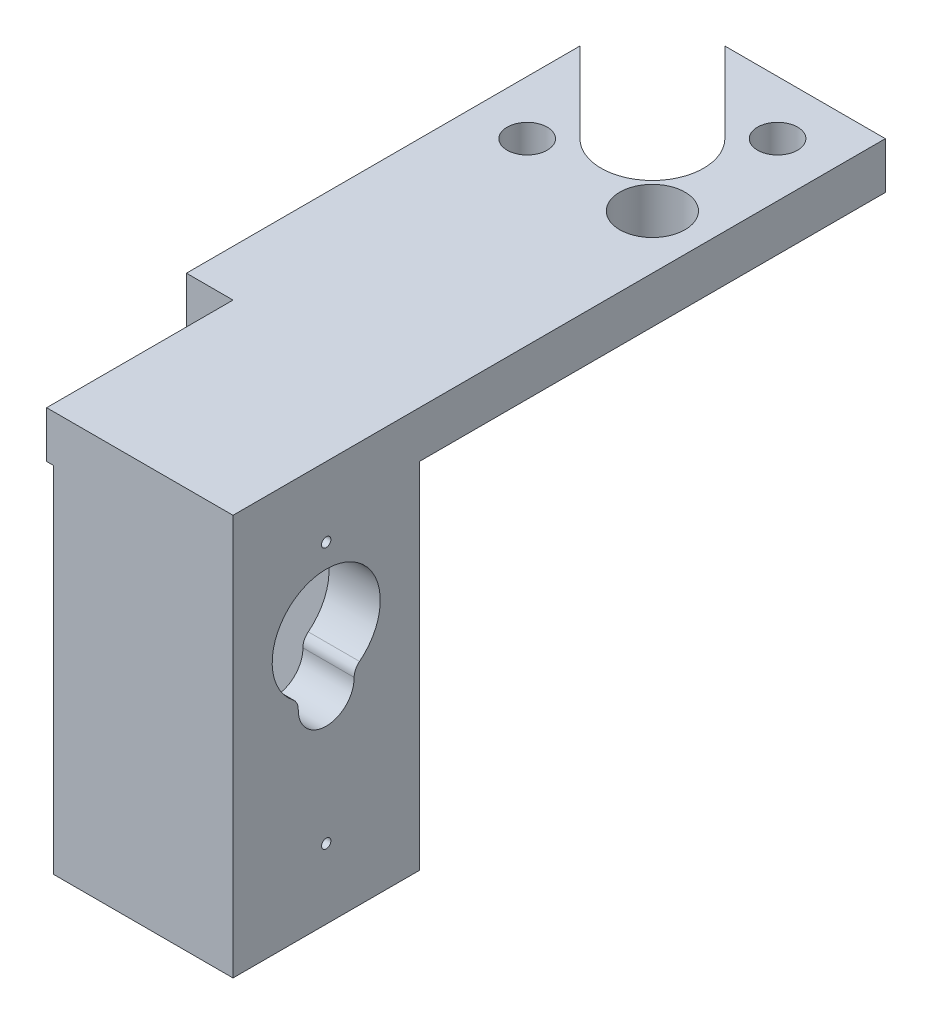
ISO-10303-21;
HEADER;
FILE_DESCRIPTION(('STEP AP214'),'2;1');
FILE_NAME('part.step','',(''),(''),'','','');
FILE_SCHEMA(('AUTOMOTIVE_DESIGN { 1 0 10303 214 1 1 1 1 }'));
ENDSEC;
DATA;
#1=APPLICATION_CONTEXT('core data for automotive mechanical design processes');
#2=APPLICATION_PROTOCOL_DEFINITION('international standard','automotive_design',2000,#1);
#3=PRODUCT_CONTEXT('',#1,'mechanical');
#4=PRODUCT('Part','Part','',(#3));
#5=PRODUCT_RELATED_PRODUCT_CATEGORY('part','',(#4));
#6=PRODUCT_DEFINITION_FORMATION('','',#4);
#7=PRODUCT_DEFINITION_CONTEXT('part definition',#1,'design');
#8=PRODUCT_DEFINITION('design','',#6,#7);
#9=PRODUCT_DEFINITION_SHAPE('','',#8);
#10=(LENGTH_UNIT() NAMED_UNIT(*) SI_UNIT(.MILLI.,.METRE.));
#11=(NAMED_UNIT(*) PLANE_ANGLE_UNIT() SI_UNIT($,.RADIAN.));
#12=(NAMED_UNIT(*) SI_UNIT($,.STERADIAN.) SOLID_ANGLE_UNIT());
#13=UNCERTAINTY_MEASURE_WITH_UNIT(LENGTH_MEASURE(1.E-05),#10,'distance_accuracy_value','');
#14=(GEOMETRIC_REPRESENTATION_CONTEXT(3) GLOBAL_UNCERTAINTY_ASSIGNED_CONTEXT((#13)) GLOBAL_UNIT_ASSIGNED_CONTEXT((#10,
#11,#12)) REPRESENTATION_CONTEXT('',''));
#15=CARTESIAN_POINT('',(0.,0.,0.));
#16=DIRECTION('',(0.,0.,1.));
#17=DIRECTION('',(1.,0.,0.));
#18=AXIS2_PLACEMENT_3D('',#15,#16,#17);
#19=CARTESIAN_POINT('',(0.,374.684836728763,0.));
#20=DIRECTION('',(0.,1.,0.));
#21=DIRECTION('',(0.,0.,1.));
#22=AXIS2_PLACEMENT_3D('',#19,#20,#21);
#23=PLANE('',#22);
#24=DIRECTION('',(0.,0.,-1.));
#25=VECTOR('',#24,1.);
#26=CARTESIAN_POINT('',(-20.2411337173931,374.684836728763,0.));
#27=LINE('',#26,#25);
#28=CARTESIAN_POINT('',(-20.2411337173931,374.684836728763,322.549454326368));
#29=VERTEX_POINT('',#28);
#30=CARTESIAN_POINT('',(-20.2411337173931,374.684836728763,302.549454326368));
#31=VERTEX_POINT('',#30);
#32=EDGE_CURVE('E291',#29,#31,#27,.T.);
#33=ORIENTED_EDGE('',*,*,#32,.T.);
#34=DIRECTION('',(-1.,0.,0.));
#35=VECTOR('',#34,1.);
#36=CARTESIAN_POINT('',(0.,374.684836728763,302.549454326368));
#37=LINE('',#36,#35);
#38=CARTESIAN_POINT('',(-25.2411337173932,374.684836728763,302.549454326368));
#39=VERTEX_POINT('',#38);
#40=EDGE_CURVE('E299',#31,#39,#37,.T.);
#41=ORIENTED_EDGE('',*,*,#40,.T.);
#42=DIRECTION('',(0.,0.,1.));
#43=VECTOR('',#42,1.);
#44=CARTESIAN_POINT('',(-25.2411337173931,374.684836728763,0.));
#45=LINE('',#44,#43);
#46=CARTESIAN_POINT('',(-25.2411337173932,374.684836728763,260.32762891942));
#47=VERTEX_POINT('',#46);
#48=EDGE_CURVE('E320',#47,#39,#45,.T.);
#49=ORIENTED_EDGE('',*,*,#48,.F.);
#50=DIRECTION('',(0.707106781186547,0.,0.707106781186548));
#51=VECTOR('',#50,1.);
#52=CARTESIAN_POINT('',(-142.784381318406,374.684836728763,142.784381318406));
#53=LINE('',#52,#51);
#54=CARTESIAN_POINT('',(-16.6302210139191,374.684836728763,268.938541622893));
#55=VERTEX_POINT('',#54);
#56=EDGE_CURVE('E329',#47,#55,#53,.T.);
#57=ORIENTED_EDGE('',*,*,#56,.T.);
#58=CARTESIAN_POINT('',(-12.7411337173932,374.684836728763,265.049454326367));
#59=DIRECTION('',(0.,1.,0.));
#60=DIRECTION('',(0.,0.,1.));
#61=AXIS2_PLACEMENT_3D('',#58,#59,#60);
#62=CIRCLE('',#61,5.5);
#63=CARTESIAN_POINT('',(-8.8520464208672,374.684836728763,261.160367029841));
#64=VERTEX_POINT('',#63);
#65=EDGE_CURVE('E421',#55,#64,#62,.T.);
#66=ORIENTED_EDGE('',*,*,#65,.T.);
#67=DIRECTION('',(-0.707106781186549,0.,-0.707106781186546));
#68=VECTOR('',#67,1.);
#69=CARTESIAN_POINT('',(-135.006206725354,374.684836728763,135.006206725355));
#70=LINE('',#69,#68);
#71=CARTESIAN_POINT('',(-17.4629591243411,374.684836728763,252.549454326368));
#72=VERTEX_POINT('',#71);
#73=EDGE_CURVE('E336',#64,#72,#70,.T.);
#74=ORIENTED_EDGE('',*,*,#73,.T.);
#75=DIRECTION('',(-1.,0.,0.));
#76=VECTOR('',#75,1.);
#77=CARTESIAN_POINT('',(-5.60772438099305E-13,374.684836728763,252.549454326368));
#78=LINE('',#77,#76);
#79=CARTESIAN_POINT('',(-0.241133717393146,374.684836728763,252.549454326368));
#80=VERTEX_POINT('',#79);
#81=EDGE_CURVE('E325',#80,#72,#78,.T.);
#82=ORIENTED_EDGE('',*,*,#81,.F.);
#83=DIRECTION('',(0.,0.,1.));
#84=VECTOR('',#83,1.);
#85=CARTESIAN_POINT('',(-0.241133717393153,374.684836728763,0.));
#86=LINE('',#85,#84);
#87=CARTESIAN_POINT('',(-0.241133717393145,374.684836728763,302.549454326368));
#88=VERTEX_POINT('',#87);
#89=EDGE_CURVE('E319',#80,#88,#86,.T.);
#90=ORIENTED_EDGE('',*,*,#89,.T.);
#91=DIRECTION('',(1.,0.,0.));
#92=VECTOR('',#91,1.);
#93=CARTESIAN_POINT('',(-5.74113371739314,374.684836728763,302.549454326368));
#94=LINE('',#93,#92);
#95=CARTESIAN_POINT('',(-19.4911337173931,374.684836728763,302.549454326368));
#96=VERTEX_POINT('',#95);
#97=EDGE_CURVE('E422',#96,#88,#94,.T.);
#98=ORIENTED_EDGE('',*,*,#97,.F.);
#99=DIRECTION('',(0.,0.,-1.));
#100=VECTOR('',#99,1.);
#101=CARTESIAN_POINT('',(-19.4911337173932,374.684836728763,0.));
#102=LINE('',#101,#100);
#103=CARTESIAN_POINT('',(-19.4911337173931,374.684836728763,306.549454326368));
#104=VERTEX_POINT('',#103);
#105=EDGE_CURVE('E519',#104,#96,#102,.T.);
#106=ORIENTED_EDGE('',*,*,#105,.F.);
#107=DIRECTION('',(1.,0.,0.));
#108=VECTOR('',#107,1.);
#109=CARTESIAN_POINT('',(-19.4911337173931,374.684836728763,306.549454326368));
#110=LINE('',#109,#108);
#111=CARTESIAN_POINT('',(-7.49113371739314,374.684836728763,306.549454326368));
#112=VERTEX_POINT('',#111);
#113=EDGE_CURVE('E531',#104,#112,#110,.T.);
#114=ORIENTED_EDGE('',*,*,#113,.T.);
#115=DIRECTION('',(0.,0.,-1.));
#116=VECTOR('',#115,1.);
#117=CARTESIAN_POINT('',(-7.49113371739315,374.684836728763,0.));
#118=LINE('',#117,#116);
#119=CARTESIAN_POINT('',(-7.49113371739314,374.684836728763,318.549454326368));
#120=VERTEX_POINT('',#119);
#121=EDGE_CURVE('E575',#120,#112,#118,.T.);
#122=ORIENTED_EDGE('',*,*,#121,.F.);
#123=DIRECTION('',(1.,0.,0.));
#124=VECTOR('',#123,1.);
#125=CARTESIAN_POINT('',(-19.4911337173931,374.684836728763,318.549454326368));
#126=LINE('',#125,#124);
#127=CARTESIAN_POINT('',(-19.4911337173931,374.684836728763,318.549454326368));
#128=VERTEX_POINT('',#127);
#129=EDGE_CURVE('E499',#128,#120,#126,.T.);
#130=ORIENTED_EDGE('',*,*,#129,.F.);
#131=DIRECTION('',(0.,0.,-1.));
#132=VECTOR('',#131,1.);
#133=CARTESIAN_POINT('',(-19.4911337173932,374.684836728763,0.));
#134=LINE('',#133,#132);
#135=CARTESIAN_POINT('',(-19.4911337173931,374.684836728763,322.549454326368));
#136=VERTEX_POINT('',#135);
#137=EDGE_CURVE('E317',#136,#128,#134,.T.);
#138=ORIENTED_EDGE('',*,*,#137,.F.);
#139=DIRECTION('',(-1.,0.,0.));
#140=VECTOR('',#139,1.);
#141=CARTESIAN_POINT('',(-7.16203661546827E-13,374.684836728763,322.549454326368));
#142=LINE('',#141,#140);
#143=EDGE_CURVE('E307',#136,#29,#142,.T.);
#144=ORIENTED_EDGE('',*,*,#143,.T.);
#145=EDGE_LOOP('',(#33,#41,#49,#57,#66,#74,#82,#90,#98,#106,#114,#122,#130,#138,#144));
#146=FACE_BOUND('',#145,.T.);
#147=CARTESIAN_POINT('',(-6.02361843508116,374.684836728763,258.331940766135));
#148=DIRECTION('',(0.,1.,0.));
#149=DIRECTION('',(0.,0.,1.));
#150=AXIS2_PLACEMENT_3D('',#147,#148,#149);
#151=CIRCLE('',#150,2.15);
#152=CARTESIAN_POINT('',(-6.02361843508116,374.684836728763,260.481940766135));
#153=VERTEX_POINT('',#152);
#154=EDGE_CURVE('E344',#153,#153,#151,.T.);
#155=ORIENTED_EDGE('',*,*,#154,.T.);
#156=EDGE_LOOP('',(#155));
#157=FACE_BOUND('',#156,.T.);
#158=CARTESIAN_POINT('',(-19.4586489997051,374.684836728763,271.7669678866));
#159=DIRECTION('',(0.,1.,0.));
#160=DIRECTION('',(0.,0.,1.));
#161=AXIS2_PLACEMENT_3D('',#158,#159,#160);
#162=CIRCLE('',#161,2.15);
#163=CARTESIAN_POINT('',(-19.4586489997051,374.684836728763,273.9169678866));
#164=VERTEX_POINT('',#163);
#165=EDGE_CURVE('E340',#164,#164,#162,.T.);
#166=ORIENTED_EDGE('',*,*,#165,.T.);
#167=EDGE_LOOP('',(#166));
#168=FACE_BOUND('',#167,.T.);
#169=CARTESIAN_POINT('',(-6.02361893947252,374.684836728763,271.766970826347));
#170=DIRECTION('',(0.,1.,0.));
#171=DIRECTION('',(0.,0.,1.));
#172=AXIS2_PLACEMENT_3D('',#169,#170,#171);
#173=CIRCLE('',#172,3.5);
#174=CARTESIAN_POINT('',(-6.02361893947252,374.684836728763,275.266970826347));
#175=VERTEX_POINT('',#174);
#176=EDGE_CURVE('E417',#175,#175,#173,.T.);
#177=ORIENTED_EDGE('',*,*,#176,.T.);
#178=EDGE_LOOP('',(#177));
#179=FACE_BOUND('',#178,.T.);
#180=ADVANCED_FACE('F79',(#146,#157,#168,#179),#23,.F.);
#181=CARTESIAN_POINT('',(-7.4911337173931,0.,0.));
#182=DIRECTION('',(1.,0.,0.));
#183=DIRECTION('',(0.,1.,0.));
#184=AXIS2_PLACEMENT_3D('',#181,#182,#183);
#185=PLANE('',#184);
#186=CARTESIAN_POINT('',(-7.49113371739314,372.184836728763,312.549454326368));
#187=DIRECTION('',(1.,0.,0.));
#188=DIRECTION('',(0.,1.,0.));
#189=AXIS2_PLACEMENT_3D('',#186,#187,#188);
#190=CIRCLE('',#189,0.500000000000026);
#191=CARTESIAN_POINT('',(-7.49113371739314,372.684836728763,312.549454326368));
#192=VERTEX_POINT('',#191);
#193=EDGE_CURVE('E311',#192,#192,#190,.T.);
#194=ORIENTED_EDGE('',*,*,#193,.T.);
#195=EDGE_LOOP('',(#194));
#196=FACE_BOUND('',#195,.T.);
#197=DIRECTION('',(0.,-1.,0.));
#198=VECTOR('',#197,1.);
#199=CARTESIAN_POINT('',(-7.49113371739309,0.,318.549454326368));
#200=LINE('',#199,#198);
#201=CARTESIAN_POINT('',(-7.49113371739314,369.684836728764,318.549454326368));
#202=VERTEX_POINT('',#201);
#203=EDGE_CURVE('E532',#120,#202,#200,.T.);
#204=ORIENTED_EDGE('',*,*,#203,.F.);
#205=ORIENTED_EDGE('',*,*,#121,.T.);
#206=DIRECTION('',(0.,-1.,0.));
#207=VECTOR('',#206,1.);
#208=CARTESIAN_POINT('',(-7.49113371739309,0.,306.549454326368));
#209=LINE('',#208,#207);
#210=CARTESIAN_POINT('',(-7.49113371739314,369.684836728764,306.549454326368));
#211=VERTEX_POINT('',#210);
#212=EDGE_CURVE('E497',#112,#211,#209,.T.);
#213=ORIENTED_EDGE('',*,*,#212,.T.);
#214=DIRECTION('',(0.,0.,-1.));
#215=VECTOR('',#214,1.);
#216=CARTESIAN_POINT('',(-7.49113371739315,369.684836728764,0.));
#217=LINE('',#216,#215);
#218=EDGE_CURVE('E554',#202,#211,#217,.T.);
#219=ORIENTED_EDGE('',*,*,#218,.F.);
#220=EDGE_LOOP('',(#204,#205,#213,#219));
#221=FACE_BOUND('',#220,.T.);
#222=ADVANCED_FACE('F641',(#196,#221),#185,.F.);
#223=CARTESIAN_POINT('',(-7.49113371739314,344.184836728764,312.549454326368));
#224=DIRECTION('',(1.,0.,0.));
#225=DIRECTION('',(0.,1.,0.));
#226=AXIS2_PLACEMENT_3D('',#223,#224,#225);
#227=CIRCLE('',#226,0.500000000000026);
#228=CARTESIAN_POINT('',(-7.49113371739314,344.684836728764,312.549454326368));
#229=VERTEX_POINT('',#228);
#230=EDGE_CURVE('E622',#229,#229,#227,.T.);
#231=ORIENTED_EDGE('',*,*,#230,.T.);
#232=EDGE_LOOP('',(#231));
#233=FACE_BOUND('',#232,.T.);
#234=CARTESIAN_POINT('',(-7.49113371739314,346.684836728764,318.549454326368));
#235=VERTEX_POINT('',#234);
#236=CARTESIAN_POINT('',(-7.49113371739314,341.684836728764,318.549454326368));
#237=VERTEX_POINT('',#236);
#238=EDGE_CURVE('E508',#235,#237,#200,.T.);
#239=ORIENTED_EDGE('',*,*,#238,.F.);
#240=DIRECTION('',(0.,0.,-1.));
#241=VECTOR('',#240,1.);
#242=CARTESIAN_POINT('',(-7.49113371739315,346.684836728764,0.));
#243=LINE('',#242,#241);
#244=CARTESIAN_POINT('',(-7.49113371739314,346.684836728764,306.549454326368));
#245=VERTEX_POINT('',#244);
#246=EDGE_CURVE('E550',#235,#245,#243,.T.);
#247=ORIENTED_EDGE('',*,*,#246,.T.);
#248=CARTESIAN_POINT('',(-7.49113371739314,341.684836728764,306.549454326368));
#249=VERTEX_POINT('',#248);
#250=EDGE_CURVE('E539',#245,#249,#209,.T.);
#251=ORIENTED_EDGE('',*,*,#250,.T.);
#252=DIRECTION('',(0.,0.,-1.));
#253=VECTOR('',#252,1.);
#254=CARTESIAN_POINT('',(-7.49113371739315,341.684836728764,0.));
#255=LINE('',#254,#253);
#256=EDGE_CURVE('E535',#237,#249,#255,.T.);
#257=ORIENTED_EDGE('',*,*,#256,.F.);
#258=EDGE_LOOP('',(#239,#247,#251,#257));
#259=FACE_BOUND('',#258,.T.);
#260=ADVANCED_FACE('F644',(#233,#259),#185,.F.);
#261=CARTESIAN_POINT('',(-5.7411337173931,0.,0.));
#262=DIRECTION('',(1.,0.,0.));
#263=DIRECTION('',(0.,1.,0.));
#264=AXIS2_PLACEMENT_3D('',#261,#262,#263);
#265=PLANE('',#264);
#266=DIRECTION('',(0.,0.,-1.));
#267=VECTOR('',#266,1.);
#268=CARTESIAN_POINT('',(-5.74113371739315,346.684836728764,0.));
#269=LINE('',#268,#267);
#270=CARTESIAN_POINT('',(-5.74113371739314,346.684836728764,318.549454326368));
#271=VERTEX_POINT('',#270);
#272=CARTESIAN_POINT('',(-5.74113371739314,346.684836728764,306.549454326368));
#273=VERTEX_POINT('',#272);
#274=EDGE_CURVE('E500',#271,#273,#269,.T.);
#275=ORIENTED_EDGE('',*,*,#274,.F.);
#276=DIRECTION('',(0.,-1.,0.));
#277=VECTOR('',#276,1.);
#278=CARTESIAN_POINT('',(-5.74113371739309,0.,318.549454326368));
#279=LINE('',#278,#277);
#280=CARTESIAN_POINT('',(-5.74113371739314,369.684836728764,318.549454326368));
#281=VERTEX_POINT('',#280);
#282=EDGE_CURVE('E555',#281,#271,#279,.T.);
#283=ORIENTED_EDGE('',*,*,#282,.F.);
#284=DIRECTION('',(0.,0.,-1.));
#285=VECTOR('',#284,1.);
#286=CARTESIAN_POINT('',(-5.74113371739315,369.684836728764,0.));
#287=LINE('',#286,#285);
#288=CARTESIAN_POINT('',(-5.74113371739314,369.684836728764,312.549454326368));
#289=VERTEX_POINT('',#288);
#290=EDGE_CURVE('E565',#281,#289,#287,.T.);
#291=ORIENTED_EDGE('',*,*,#290,.T.);
#292=CARTESIAN_POINT('',(-5.74113371739314,363.884836728764,312.549454326368));
#293=DIRECTION('',(1.,0.,0.));
#294=DIRECTION('',(0.,1.,0.));
#295=AXIS2_PLACEMENT_3D('',#292,#293,#294);
#296=CIRCLE('',#295,5.80000000000001);
#297=CARTESIAN_POINT('',(-5.74113371739314,359.317713441092,316.124560601041));
#298=VERTEX_POINT('',#297);
#299=EDGE_CURVE('E591',#289,#298,#296,.T.);
#300=ORIENTED_EDGE('',*,*,#299,.T.);
#301=CARTESIAN_POINT('',(-5.74113371739314,358.136560866695,317.049157051388));
#302=DIRECTION('',(1.,0.,0.));
#303=DIRECTION('',(0.,1.,0.));
#304=AXIS2_PLACEMENT_3D('',#301,#302,#303);
#305=CIRCLE('',#304,1.50000000000003);
#306=CARTESIAN_POINT('',(-5.74113371739314,358.119319487384,315.549256143048));
#307=VERTEX_POINT('',#306);
#308=EDGE_CURVE('E457',#307,#298,#305,.T.);
#309=ORIENTED_EDGE('',*,*,#308,.F.);
#310=CARTESIAN_POINT('',(-5.74113371739314,358.084836728764,312.549454326368));
#311=DIRECTION('',(1.,0.,0.));
#312=DIRECTION('',(0.,1.,0.));
#313=AXIS2_PLACEMENT_3D('',#310,#311,#312);
#314=CIRCLE('',#313,2.99999999999999);
#315=CARTESIAN_POINT('',(-5.74113371739314,358.119319487384,309.549652509687));
#316=VERTEX_POINT('',#315);
#317=EDGE_CURVE('E490',#307,#316,#314,.T.);
#318=ORIENTED_EDGE('',*,*,#317,.T.);
#319=CARTESIAN_POINT('',(-5.74113371739314,358.136560866695,308.049751601347));
#320=DIRECTION('',(1.,0.,0.));
#321=DIRECTION('',(0.,1.,0.));
#322=AXIS2_PLACEMENT_3D('',#319,#320,#321);
#323=CIRCLE('',#322,1.50000000000003);
#324=CARTESIAN_POINT('',(-5.74113371739314,359.317713441092,308.974348051694));
#325=VERTEX_POINT('',#324);
#326=EDGE_CURVE('E596',#316,#325,#323,.F.);
#327=ORIENTED_EDGE('',*,*,#326,.T.);
#328=EDGE_CURVE('E592',#325,#289,#296,.T.);
#329=ORIENTED_EDGE('',*,*,#328,.T.);
#330=DIRECTION('',(0.,0.,-1.));
#331=VECTOR('',#330,1.);
#332=CARTESIAN_POINT('',(-5.74113371739315,369.684836728764,0.));
#333=LINE('',#332,#331);
#334=CARTESIAN_POINT('',(-5.74113371739314,369.684836728764,306.549454326368));
#335=VERTEX_POINT('',#334);
#336=EDGE_CURVE('E367',#289,#335,#333,.T.);
#337=ORIENTED_EDGE('',*,*,#336,.T.);
#338=DIRECTION('',(0.,-1.,0.));
#339=VECTOR('',#338,1.);
#340=CARTESIAN_POINT('',(-5.74113371739309,0.,306.549454326368));
#341=LINE('',#340,#339);
#342=EDGE_CURVE('E561',#335,#273,#341,.T.);
#343=ORIENTED_EDGE('',*,*,#342,.T.);
#344=EDGE_LOOP('',(#275,#283,#291,#300,#309,#318,#327,#329,#337,#343));
#345=FACE_BOUND('',#344,.T.);
#346=ADVANCED_FACE('F672',(#345),#265,.F.);
#347=CARTESIAN_POINT('',(-12.7411337173932,379.684836728763,265.049454326367));
#348=DIRECTION('',(0.,-1.,0.));
#349=DIRECTION('',(0.,0.,-1.));
#350=AXIS2_PLACEMENT_3D('',#347,#348,#349);
#351=CYLINDRICAL_SURFACE('',#350,5.5);
#352=ORIENTED_EDGE('',*,*,#65,.F.);
#353=DIRECTION('',(0.,-1.,0.));
#354=VECTOR('',#353,1.);
#355=CARTESIAN_POINT('',(-16.6302210139191,379.684836728763,268.938541622893));
#356=LINE('',#355,#354);
#357=CARTESIAN_POINT('',(-16.6302210139191,379.684836728763,268.938541622893));
#358=VERTEX_POINT('',#357);
#359=EDGE_CURVE('E364',#358,#55,#356,.T.);
#360=ORIENTED_EDGE('',*,*,#359,.F.);
#361=CARTESIAN_POINT('',(-12.7411337173932,379.684836728763,265.049454326367));
#362=DIRECTION('',(0.,1.,0.));
#363=DIRECTION('',(0.,0.,1.));
#364=AXIS2_PLACEMENT_3D('',#361,#362,#363);
#365=CIRCLE('',#364,5.5);
#366=CARTESIAN_POINT('',(-8.8520464208672,379.684836728763,261.160367029841));
#367=VERTEX_POINT('',#366);
#368=EDGE_CURVE('E396',#358,#367,#365,.T.);
#369=ORIENTED_EDGE('',*,*,#368,.T.);
#370=DIRECTION('',(0.,-1.,0.));
#371=VECTOR('',#370,1.);
#372=CARTESIAN_POINT('',(-8.8520464208672,379.684836728763,261.160367029841));
#373=LINE('',#372,#371);
#374=EDGE_CURVE('E349',#367,#64,#373,.T.);
#375=ORIENTED_EDGE('',*,*,#374,.T.);
#376=EDGE_LOOP('',(#352,#360,#369,#375));
#377=FACE_BOUND('',#376,.T.);
#378=ADVANCED_FACE('F436',(#377),#351,.F.);
#379=CARTESIAN_POINT('',(-142.784381318406,379.684836728763,142.784381318406));
#380=DIRECTION('',(0.707106781186548,0.,-0.707106781186547));
#381=DIRECTION('',(-0.707106781186547,0.,-0.707106781186548));
#382=AXIS2_PLACEMENT_3D('',#379,#380,#381);
#383=PLANE('',#382);
#384=ORIENTED_EDGE('',*,*,#56,.F.);
#385=DIRECTION('',(0.,-1.,0.));
#386=VECTOR('',#385,1.);
#387=CARTESIAN_POINT('',(-25.2411337173932,379.684836728763,260.32762891942));
#388=LINE('',#387,#386);
#389=CARTESIAN_POINT('',(-25.2411337173932,379.684836728763,260.32762891942));
#390=VERTEX_POINT('',#389);
#391=EDGE_CURVE('E361',#390,#47,#388,.T.);
#392=ORIENTED_EDGE('',*,*,#391,.F.);
#393=DIRECTION('',(0.707106781186547,0.,0.707106781186548));
#394=VECTOR('',#393,1.);
#395=CARTESIAN_POINT('',(-142.784381318406,379.684836728763,142.784381318406));
#396=LINE('',#395,#394);
#397=EDGE_CURVE('E387',#390,#358,#396,.T.);
#398=ORIENTED_EDGE('',*,*,#397,.T.);
#399=ORIENTED_EDGE('',*,*,#359,.T.);
#400=EDGE_LOOP('',(#384,#392,#398,#399));
#401=FACE_BOUND('',#400,.T.);
#402=ADVANCED_FACE('F433',(#401),#383,.T.);
#403=CARTESIAN_POINT('',(-25.2411337173931,379.684836728763,0.));
#404=DIRECTION('',(1.,0.,0.));
#405=DIRECTION('',(0.,0.,-1.));
#406=AXIS2_PLACEMENT_3D('',#403,#404,#405);
#407=PLANE('',#406);
#408=ORIENTED_EDGE('',*,*,#48,.T.);
#409=DIRECTION('',(0.,1.,0.));
#410=VECTOR('',#409,1.);
#411=CARTESIAN_POINT('',(-25.2411337173932,336.684836728764,302.549454326368));
#412=LINE('',#411,#410);
#413=CARTESIAN_POINT('',(-25.2411337173932,379.684836728763,302.549454326368));
#414=VERTEX_POINT('',#413);
#415=EDGE_CURVE('E300',#39,#414,#412,.T.);
#416=ORIENTED_EDGE('',*,*,#415,.T.);
#417=DIRECTION('',(0.,0.,1.));
#418=VECTOR('',#417,1.);
#419=CARTESIAN_POINT('',(-25.2411337173931,379.684836728763,0.));
#420=LINE('',#419,#418);
#421=EDGE_CURVE('E384',#390,#414,#420,.T.);
#422=ORIENTED_EDGE('',*,*,#421,.F.);
#423=ORIENTED_EDGE('',*,*,#391,.T.);
#424=EDGE_LOOP('',(#408,#416,#422,#423));
#425=FACE_BOUND('',#424,.T.);
#426=ADVANCED_FACE('F729',(#425),#407,.F.);
#427=CARTESIAN_POINT('',(-7.1690488375349E-13,379.684836728763,322.549454326368));
#428=DIRECTION('',(0.,0.,1.));
#429=DIRECTION('',(1.,0.,0.));
#430=AXIS2_PLACEMENT_3D('',#427,#428,#429);
#431=PLANE('',#430);
#432=DIRECTION('',(0.,1.,0.));
#433=VECTOR('',#432,1.);
#434=CARTESIAN_POINT('',(-20.2411337173931,336.684836728764,322.549454326368));
#435=LINE('',#434,#433);
#436=CARTESIAN_POINT('',(-20.2411337173931,379.684836728763,322.549454326367));
#437=VERTEX_POINT('',#436);
#438=EDGE_CURVE('E98',#29,#437,#435,.T.);
#439=ORIENTED_EDGE('',*,*,#438,.F.);
#440=ORIENTED_EDGE('',*,*,#143,.F.);
#441=DIRECTION('',(0.,-1.,0.));
#442=VECTOR('',#441,1.);
#443=CARTESIAN_POINT('',(-19.4911337173931,0.,322.549454326368));
#444=LINE('',#443,#442);
#445=CARTESIAN_POINT('',(-19.4911337173931,336.684836728764,322.549454326368));
#446=VERTEX_POINT('',#445);
#447=EDGE_CURVE('E528',#136,#446,#444,.T.);
#448=ORIENTED_EDGE('',*,*,#447,.T.);
#449=DIRECTION('',(1.,0.,0.));
#450=VECTOR('',#449,1.);
#451=CARTESIAN_POINT('',(-5.74113371739314,336.684836728764,322.549454326368));
#452=LINE('',#451,#450);
#453=CARTESIAN_POINT('',(-0.241133717393139,336.684836728764,322.549454326368));
#454=VERTEX_POINT('',#453);
#455=EDGE_CURVE('E469',#446,#454,#452,.T.);
#456=ORIENTED_EDGE('',*,*,#455,.T.);
#457=DIRECTION('',(0.,-1.,0.));
#458=VECTOR('',#457,1.);
#459=CARTESIAN_POINT('',(-0.241133717393145,379.684836728763,322.549454326368));
#460=LINE('',#459,#458);
#461=CARTESIAN_POINT('',(-0.241133717393145,379.684836728763,322.549454326368));
#462=VERTEX_POINT('',#461);
#463=EDGE_CURVE('E358',#462,#454,#460,.T.);
#464=ORIENTED_EDGE('',*,*,#463,.F.);
#465=DIRECTION('',(-1.,0.,0.));
#466=VECTOR('',#465,1.);
#467=CARTESIAN_POINT('',(-7.1690488375349E-13,379.684836728763,322.549454326368));
#468=LINE('',#467,#466);
#469=EDGE_CURVE('E309',#462,#437,#468,.T.);
#470=ORIENTED_EDGE('',*,*,#469,.T.);
#471=EDGE_LOOP('',(#439,#440,#448,#456,#464,#470));
#472=FACE_BOUND('',#471,.T.);
#473=ADVANCED_FACE('F305',(#472),#431,.T.);
#474=CARTESIAN_POINT('',(-0.241133717393153,379.684836728763,0.));
#475=DIRECTION('',(1.,0.,0.));
#476=DIRECTION('',(0.,1.,0.));
#477=AXIS2_PLACEMENT_3D('',#474,#475,#476);
#478=PLANE('',#477);
#479=CARTESIAN_POINT('',(-0.241133717393136,372.184836728763,312.549454326368));
#480=DIRECTION('',(-1.,0.,0.));
#481=DIRECTION('',(0.,-1.,0.));
#482=AXIS2_PLACEMENT_3D('',#479,#480,#481);
#483=CIRCLE('',#482,0.500000000000026);
#484=CARTESIAN_POINT('',(-0.241133717393136,371.684836728763,312.549454326368));
#485=VERTEX_POINT('',#484);
#486=EDGE_CURVE('E617',#485,#485,#483,.T.);
#487=ORIENTED_EDGE('',*,*,#486,.T.);
#488=EDGE_LOOP('',(#487));
#489=FACE_BOUND('',#488,.T.);
#490=CARTESIAN_POINT('',(-0.241133717393133,344.184836728764,312.549454326368));
#491=DIRECTION('',(-1.,0.,0.));
#492=DIRECTION('',(0.,-1.,0.));
#493=AXIS2_PLACEMENT_3D('',#490,#491,#492);
#494=CIRCLE('',#493,0.500000000000026);
#495=CARTESIAN_POINT('',(-0.241133717393133,343.684836728764,312.549454326368));
#496=VERTEX_POINT('',#495);
#497=EDGE_CURVE('E615',#496,#496,#494,.T.);
#498=ORIENTED_EDGE('',*,*,#497,.T.);
#499=EDGE_LOOP('',(#498));
#500=FACE_BOUND('',#499,.T.);
#501=ORIENTED_EDGE('',*,*,#89,.F.);
#502=DIRECTION('',(0.,-1.,0.));
#503=VECTOR('',#502,1.);
#504=CARTESIAN_POINT('',(-0.241133717393147,379.684836728763,252.549454326368));
#505=LINE('',#504,#503);
#506=CARTESIAN_POINT('',(-0.241133717393147,379.684836728763,252.549454326368));
#507=VERTEX_POINT('',#506);
#508=EDGE_CURVE('E355',#507,#80,#505,.T.);
#509=ORIENTED_EDGE('',*,*,#508,.F.);
#510=DIRECTION('',(0.,0.,1.));
#511=VECTOR('',#510,1.);
#512=CARTESIAN_POINT('',(-0.241133717393153,379.684836728763,0.));
#513=LINE('',#512,#511);
#514=EDGE_CURVE('E393',#507,#462,#513,.T.);
#515=ORIENTED_EDGE('',*,*,#514,.T.);
#516=ORIENTED_EDGE('',*,*,#463,.T.);
#517=DIRECTION('',(0.,0.,-1.));
#518=VECTOR('',#517,1.);
#519=CARTESIAN_POINT('',(-0.241133717393147,336.684836728764,0.));
#520=LINE('',#519,#518);
#521=CARTESIAN_POINT('',(-0.24113371739314,336.684836728764,302.549454326368));
#522=VERTEX_POINT('',#521);
#523=EDGE_CURVE('E454',#454,#522,#520,.T.);
#524=ORIENTED_EDGE('',*,*,#523,.T.);
#525=DIRECTION('',(0.,-1.,0.));
#526=VECTOR('',#525,1.);
#527=CARTESIAN_POINT('',(-0.241133717393093,0.,302.549454326368));
#528=LINE('',#527,#526);
#529=EDGE_CURVE('E451',#88,#522,#528,.T.);
#530=ORIENTED_EDGE('',*,*,#529,.F.);
#531=EDGE_LOOP('',(#501,#509,#515,#516,#524,#530));
#532=FACE_BOUND('',#531,.T.);
#533=CARTESIAN_POINT('',(-0.241133717393143,358.136560866695,317.049157051388));
#534=DIRECTION('',(1.,0.,0.));
#535=DIRECTION('',(0.,1.,0.));
#536=AXIS2_PLACEMENT_3D('',#533,#534,#535);
#537=CIRCLE('',#536,1.50000000000003);
#538=CARTESIAN_POINT('',(-0.241133717393143,358.119319487384,315.549256143048));
#539=VERTEX_POINT('',#538);
#540=CARTESIAN_POINT('',(-0.241133717393143,359.317713441092,316.124560601041));
#541=VERTEX_POINT('',#540);
#542=EDGE_CURVE('E587',#539,#541,#537,.T.);
#543=ORIENTED_EDGE('',*,*,#542,.T.);
#544=CARTESIAN_POINT('',(-0.241133717393143,363.884836728764,312.549454326368));
#545=DIRECTION('',(1.,0.,0.));
#546=DIRECTION('',(0.,1.,0.));
#547=AXIS2_PLACEMENT_3D('',#544,#545,#546);
#548=CIRCLE('',#547,5.80000000000001);
#549=CARTESIAN_POINT('',(-0.241133717393143,359.317713441092,308.974348051694));
#550=VERTEX_POINT('',#549);
#551=EDGE_CURVE('E604',#550,#541,#548,.T.);
#552=ORIENTED_EDGE('',*,*,#551,.F.);
#553=CARTESIAN_POINT('',(-0.241133717393143,358.136560866695,308.049751601347));
#554=DIRECTION('',(1.,0.,0.));
#555=DIRECTION('',(0.,1.,0.));
#556=AXIS2_PLACEMENT_3D('',#553,#554,#555);
#557=CIRCLE('',#556,1.50000000000003);
#558=CARTESIAN_POINT('',(-0.241133717393143,358.119319487384,309.549652509687));
#559=VERTEX_POINT('',#558);
#560=EDGE_CURVE('E608',#559,#550,#557,.F.);
#561=ORIENTED_EDGE('',*,*,#560,.F.);
#562=CARTESIAN_POINT('',(-0.241133717393143,358.084836728764,312.549454326368));
#563=DIRECTION('',(1.,0.,0.));
#564=DIRECTION('',(0.,1.,0.));
#565=AXIS2_PLACEMENT_3D('',#562,#563,#564);
#566=CIRCLE('',#565,2.99999999999999);
#567=EDGE_CURVE('E611',#539,#559,#566,.T.);
#568=ORIENTED_EDGE('',*,*,#567,.F.);
#569=EDGE_LOOP('',(#543,#552,#561,#568));
#570=FACE_BOUND('',#569,.T.);
#571=ADVANCED_FACE('F446',(#489,#500,#532,#570),#478,.T.);
#572=CARTESIAN_POINT('',(-5.61473660305968E-13,379.684836728763,252.549454326368));
#573=DIRECTION('',(0.,0.,1.));
#574=DIRECTION('',(1.,0.,0.));
#575=AXIS2_PLACEMENT_3D('',#572,#573,#574);
#576=PLANE('',#575);
#577=ORIENTED_EDGE('',*,*,#81,.T.);
#578=DIRECTION('',(0.,-1.,0.));
#579=VECTOR('',#578,1.);
#580=CARTESIAN_POINT('',(-17.4629591243411,379.684836728763,252.549454326368));
#581=LINE('',#580,#579);
#582=CARTESIAN_POINT('',(-17.4629591243411,379.684836728763,252.549454326368));
#583=VERTEX_POINT('',#582);
#584=EDGE_CURVE('E352',#583,#72,#581,.T.);
#585=ORIENTED_EDGE('',*,*,#584,.F.);
#586=DIRECTION('',(-1.,0.,0.));
#587=VECTOR('',#586,1.);
#588=CARTESIAN_POINT('',(-5.61473660305968E-13,379.684836728763,252.549454326368));
#589=LINE('',#588,#587);
#590=EDGE_CURVE('E403',#507,#583,#589,.T.);
#591=ORIENTED_EDGE('',*,*,#590,.F.);
#592=ORIENTED_EDGE('',*,*,#508,.T.);
#593=EDGE_LOOP('',(#577,#585,#591,#592));
#594=FACE_BOUND('',#593,.T.);
#595=ADVANCED_FACE('F719',(#594),#576,.F.);
#596=CARTESIAN_POINT('',(-19.4586489997051,379.684836728763,271.7669678866));
#597=DIRECTION('',(0.,-1.,0.));
#598=DIRECTION('',(0.,0.,-1.));
#599=AXIS2_PLACEMENT_3D('',#596,#597,#598);
#600=CYLINDRICAL_SURFACE('',#599,2.15);
#601=CARTESIAN_POINT('',(-19.4586489997051,379.684836728763,271.7669678866));
#602=DIRECTION('',(0.,1.,0.));
#603=DIRECTION('',(0.,0.,1.));
#604=AXIS2_PLACEMENT_3D('',#601,#602,#603);
#605=CIRCLE('',#604,2.15);
#606=CARTESIAN_POINT('',(-19.4586489997051,379.684836728763,273.9169678866));
#607=VERTEX_POINT('',#606);
#608=EDGE_CURVE('E410',#607,#607,#605,.T.);
#609=ORIENTED_EDGE('',*,*,#608,.T.);
#610=EDGE_LOOP('',(#609));
#611=FACE_BOUND('',#610,.T.);
#612=ORIENTED_EDGE('',*,*,#165,.F.);
#613=EDGE_LOOP('',(#612));
#614=FACE_BOUND('',#613,.T.);
#615=ADVANCED_FACE('F716',(#611,#614),#600,.F.);
#616=CARTESIAN_POINT('',(-135.006206725354,379.684836728763,135.006206725355));
#617=DIRECTION('',(-0.707106781186546,0.,0.707106781186549));
#618=DIRECTION('',(0.707106781186549,0.,0.707106781186546));
#619=AXIS2_PLACEMENT_3D('',#616,#617,#618);
#620=PLANE('',#619);
#621=ORIENTED_EDGE('',*,*,#73,.F.);
#622=ORIENTED_EDGE('',*,*,#374,.F.);
#623=DIRECTION('',(-0.707106781186549,0.,-0.707106781186546));
#624=VECTOR('',#623,1.);
#625=CARTESIAN_POINT('',(-135.006206725354,379.684836728763,135.006206725355));
#626=LINE('',#625,#624);
#627=EDGE_CURVE('E406',#367,#583,#626,.T.);
#628=ORIENTED_EDGE('',*,*,#627,.T.);
#629=ORIENTED_EDGE('',*,*,#584,.T.);
#630=EDGE_LOOP('',(#621,#622,#628,#629));
#631=FACE_BOUND('',#630,.T.);
#632=ADVANCED_FACE('F439',(#631),#620,.T.);
#633=CARTESIAN_POINT('',(-6.02361893947252,379.684836728763,271.766970826347));
#634=DIRECTION('',(0.,-1.,0.));
#635=DIRECTION('',(0.,0.,-1.));
#636=AXIS2_PLACEMENT_3D('',#633,#634,#635);
#637=CYLINDRICAL_SURFACE('',#636,3.5);
#638=CARTESIAN_POINT('',(-6.02361893947252,379.684836728763,271.766970826347));
#639=DIRECTION('',(0.,1.,0.));
#640=DIRECTION('',(0.,0.,1.));
#641=AXIS2_PLACEMENT_3D('',#638,#639,#640);
#642=CIRCLE('',#641,3.5);
#643=CARTESIAN_POINT('',(-6.02361893947252,379.684836728763,275.266970826347));
#644=VERTEX_POINT('',#643);
#645=EDGE_CURVE('E348',#644,#644,#642,.T.);
#646=ORIENTED_EDGE('',*,*,#645,.T.);
#647=EDGE_LOOP('',(#646));
#648=FACE_BOUND('',#647,.T.);
#649=ORIENTED_EDGE('',*,*,#176,.F.);
#650=EDGE_LOOP('',(#649));
#651=FACE_BOUND('',#650,.T.);
#652=ADVANCED_FACE('F81',(#648,#651),#637,.F.);
#653=CARTESIAN_POINT('',(-6.02361843508116,379.684836728763,258.331940766135));
#654=DIRECTION('',(0.,-1.,0.));
#655=DIRECTION('',(0.,0.,-1.));
#656=AXIS2_PLACEMENT_3D('',#653,#654,#655);
#657=CYLINDRICAL_SURFACE('',#656,2.15);
#658=CARTESIAN_POINT('',(-6.02361843508116,379.684836728763,258.331940766135));
#659=DIRECTION('',(0.,1.,0.));
#660=DIRECTION('',(0.,0.,1.));
#661=AXIS2_PLACEMENT_3D('',#658,#659,#660);
#662=CIRCLE('',#661,2.15);
#663=CARTESIAN_POINT('',(-6.02361843508116,379.684836728763,260.481940766135));
#664=VERTEX_POINT('',#663);
#665=EDGE_CURVE('E353',#664,#664,#662,.T.);
#666=ORIENTED_EDGE('',*,*,#665,.T.);
#667=EDGE_LOOP('',(#666));
#668=FACE_BOUND('',#667,.T.);
#669=ORIENTED_EDGE('',*,*,#154,.F.);
#670=EDGE_LOOP('',(#669));
#671=FACE_BOUND('',#670,.T.);
#672=ADVANCED_FACE('F712',(#668,#671),#657,.F.);
#673=CARTESIAN_POINT('',(0.,379.684836728763,0.));
#674=DIRECTION('',(0.,1.,0.));
#675=DIRECTION('',(0.,0.,1.));
#676=AXIS2_PLACEMENT_3D('',#673,#674,#675);
#677=PLANE('',#676);
#678=DIRECTION('',(-1.,0.,0.));
#679=VECTOR('',#678,1.);
#680=CARTESIAN_POINT('',(0.,379.684836728763,302.549454326368));
#681=LINE('',#680,#679);
#682=CARTESIAN_POINT('',(-20.2411337173931,379.684836728763,302.549454326368));
#683=VERTEX_POINT('',#682);
#684=EDGE_CURVE('E14',#683,#414,#681,.T.);
#685=ORIENTED_EDGE('',*,*,#684,.F.);
#686=DIRECTION('',(0.,0.,-1.));
#687=VECTOR('',#686,1.);
#688=CARTESIAN_POINT('',(-20.2411337173931,379.684836728763,0.));
#689=LINE('',#688,#687);
#690=EDGE_CURVE('E88',#437,#683,#689,.T.);
#691=ORIENTED_EDGE('',*,*,#690,.F.);
#692=ORIENTED_EDGE('',*,*,#469,.F.);
#693=ORIENTED_EDGE('',*,*,#514,.F.);
#694=ORIENTED_EDGE('',*,*,#590,.T.);
#695=ORIENTED_EDGE('',*,*,#627,.F.);
#696=ORIENTED_EDGE('',*,*,#368,.F.);
#697=ORIENTED_EDGE('',*,*,#397,.F.);
#698=ORIENTED_EDGE('',*,*,#421,.T.);
#699=EDGE_LOOP('',(#685,#691,#692,#693,#694,#695,#696,#697,#698));
#700=FACE_BOUND('',#699,.T.);
#701=ORIENTED_EDGE('',*,*,#645,.F.);
#702=EDGE_LOOP('',(#701));
#703=FACE_BOUND('',#702,.T.);
#704=ORIENTED_EDGE('',*,*,#608,.F.);
#705=EDGE_LOOP('',(#704));
#706=FACE_BOUND('',#705,.T.);
#707=ORIENTED_EDGE('',*,*,#665,.F.);
#708=EDGE_LOOP('',(#707));
#709=FACE_BOUND('',#708,.T.);
#710=ADVANCED_FACE('F380',(#700,#703,#706,#709),#677,.T.);
#711=CARTESIAN_POINT('',(-5.74113371739309,0.,302.549454326368));
#712=DIRECTION('',(0.,0.,1.));
#713=DIRECTION('',(1.,0.,0.));
#714=AXIS2_PLACEMENT_3D('',#711,#712,#713);
#715=PLANE('',#714);
#716=ORIENTED_EDGE('',*,*,#529,.T.);
#717=DIRECTION('',(1.,0.,0.));
#718=VECTOR('',#717,1.);
#719=CARTESIAN_POINT('',(-5.74113371739314,336.684836728764,302.549454326368));
#720=LINE('',#719,#718);
#721=CARTESIAN_POINT('',(-19.4911337173931,336.684836728764,302.549454326368));
#722=VERTEX_POINT('',#721);
#723=EDGE_CURVE('E466',#722,#522,#720,.T.);
#724=ORIENTED_EDGE('',*,*,#723,.F.);
#725=DIRECTION('',(0.,-1.,0.));
#726=VECTOR('',#725,1.);
#727=CARTESIAN_POINT('',(-19.4911337173931,0.,302.549454326368));
#728=LINE('',#727,#726);
#729=EDGE_CURVE('E462',#96,#722,#728,.T.);
#730=ORIENTED_EDGE('',*,*,#729,.F.);
#731=ORIENTED_EDGE('',*,*,#97,.T.);
#732=EDGE_LOOP('',(#716,#724,#730,#731));
#733=FACE_BOUND('',#732,.T.);
#734=ADVANCED_FACE('F460',(#733),#715,.F.);
#735=CARTESIAN_POINT('',(-5.74113371739315,336.684836728764,0.));
#736=DIRECTION('',(0.,-1.,0.));
#737=DIRECTION('',(1.,0.,0.));
#738=AXIS2_PLACEMENT_3D('',#735,#736,#737);
#739=PLANE('',#738);
#740=ORIENTED_EDGE('',*,*,#523,.F.);
#741=ORIENTED_EDGE('',*,*,#455,.F.);
#742=DIRECTION('',(0.,0.,-1.));
#743=VECTOR('',#742,1.);
#744=CARTESIAN_POINT('',(-19.4911337173931,336.684836728764,0.));
#745=LINE('',#744,#743);
#746=EDGE_CURVE('E524',#446,#722,#745,.T.);
#747=ORIENTED_EDGE('',*,*,#746,.T.);
#748=ORIENTED_EDGE('',*,*,#723,.T.);
#749=EDGE_LOOP('',(#740,#741,#747,#748));
#750=FACE_BOUND('',#749,.T.);
#751=ADVANCED_FACE('F703',(#750),#739,.T.);
#752=CARTESIAN_POINT('',(-5.74113371739314,358.136560866695,317.049157051388));
#753=DIRECTION('',(1.,0.,0.));
#754=DIRECTION('',(0.,1.,0.));
#755=AXIS2_PLACEMENT_3D('',#752,#753,#754);
#756=CYLINDRICAL_SURFACE('',#755,1.50000000000003);
#757=ORIENTED_EDGE('',*,*,#542,.F.);
#758=DIRECTION('',(1.,0.,0.));
#759=VECTOR('',#758,1.);
#760=CARTESIAN_POINT('',(-5.74113371739314,358.119319487384,315.549256143048));
#761=LINE('',#760,#759);
#762=EDGE_CURVE('E476',#307,#539,#761,.T.);
#763=ORIENTED_EDGE('',*,*,#762,.F.);
#764=ORIENTED_EDGE('',*,*,#308,.T.);
#765=DIRECTION('',(1.,0.,0.));
#766=VECTOR('',#765,1.);
#767=CARTESIAN_POINT('',(-5.74113371739314,359.317713441092,316.124560601041));
#768=LINE('',#767,#766);
#769=EDGE_CURVE('E487',#298,#541,#768,.T.);
#770=ORIENTED_EDGE('',*,*,#769,.T.);
#771=EDGE_LOOP('',(#757,#763,#764,#770));
#772=FACE_BOUND('',#771,.T.);
#773=ADVANCED_FACE('F693',(#772),#756,.T.);
#774=CARTESIAN_POINT('',(-5.74113371739314,358.084836728764,312.549454326368));
#775=DIRECTION('',(1.,0.,0.));
#776=DIRECTION('',(0.,1.,0.));
#777=AXIS2_PLACEMENT_3D('',#774,#775,#776);
#778=CYLINDRICAL_SURFACE('',#777,2.99999999999999);
#779=ORIENTED_EDGE('',*,*,#567,.T.);
#780=DIRECTION('',(1.,0.,0.));
#781=VECTOR('',#780,1.);
#782=CARTESIAN_POINT('',(-5.74113371739314,358.119319487384,309.549652509687));
#783=LINE('',#782,#781);
#784=EDGE_CURVE('E479',#316,#559,#783,.T.);
#785=ORIENTED_EDGE('',*,*,#784,.F.);
#786=ORIENTED_EDGE('',*,*,#317,.F.);
#787=ORIENTED_EDGE('',*,*,#762,.T.);
#788=EDGE_LOOP('',(#779,#785,#786,#787));
#789=FACE_BOUND('',#788,.T.);
#790=ADVANCED_FACE('F695',(#789),#778,.F.);
#791=CARTESIAN_POINT('',(-5.74113371739314,358.136560866695,308.049751601347));
#792=DIRECTION('',(1.,0.,0.));
#793=DIRECTION('',(0.,1.,0.));
#794=AXIS2_PLACEMENT_3D('',#791,#792,#793);
#795=CYLINDRICAL_SURFACE('',#794,1.50000000000003);
#796=ORIENTED_EDGE('',*,*,#560,.T.);
#797=DIRECTION('',(1.,0.,0.));
#798=VECTOR('',#797,1.);
#799=CARTESIAN_POINT('',(-5.74113371739314,359.317713441092,308.974348051694));
#800=LINE('',#799,#798);
#801=EDGE_CURVE('E483',#325,#550,#800,.T.);
#802=ORIENTED_EDGE('',*,*,#801,.F.);
#803=ORIENTED_EDGE('',*,*,#326,.F.);
#804=ORIENTED_EDGE('',*,*,#784,.T.);
#805=EDGE_LOOP('',(#796,#802,#803,#804));
#806=FACE_BOUND('',#805,.T.);
#807=ADVANCED_FACE('F687',(#806),#795,.T.);
#808=CARTESIAN_POINT('',(-5.74113371739314,363.884836728764,312.549454326368));
#809=DIRECTION('',(1.,0.,0.));
#810=DIRECTION('',(0.,1.,0.));
#811=AXIS2_PLACEMENT_3D('',#808,#809,#810);
#812=CYLINDRICAL_SURFACE('',#811,5.80000000000001);
#813=ORIENTED_EDGE('',*,*,#551,.T.);
#814=ORIENTED_EDGE('',*,*,#769,.F.);
#815=ORIENTED_EDGE('',*,*,#299,.F.);
#816=ORIENTED_EDGE('',*,*,#328,.F.);
#817=ORIENTED_EDGE('',*,*,#801,.T.);
#818=EDGE_LOOP('',(#813,#814,#815,#816,#817));
#819=FACE_BOUND('',#818,.T.);
#820=ADVANCED_FACE('F680',(#819),#812,.F.);
#821=CARTESIAN_POINT('',(-7.49113371739315,346.684836728764,0.));
#822=DIRECTION('',(0.,-1.,0.));
#823=DIRECTION('',(1.,0.,0.));
#824=AXIS2_PLACEMENT_3D('',#821,#822,#823);
#825=PLANE('',#824);
#826=ORIENTED_EDGE('',*,*,#274,.T.);
#827=DIRECTION('',(1.,0.,0.));
#828=VECTOR('',#827,1.);
#829=CARTESIAN_POINT('',(-7.49113371739314,346.684836728764,306.549454326368));
#830=LINE('',#829,#828);
#831=EDGE_CURVE('E109',#245,#273,#830,.T.);
#832=ORIENTED_EDGE('',*,*,#831,.F.);
#833=ORIENTED_EDGE('',*,*,#246,.F.);
#834=DIRECTION('',(1.,0.,0.));
#835=VECTOR('',#834,1.);
#836=CARTESIAN_POINT('',(-7.49113371739314,346.684836728764,318.549454326368));
#837=LINE('',#836,#835);
#838=EDGE_CURVE('E572',#235,#271,#837,.T.);
#839=ORIENTED_EDGE('',*,*,#838,.T.);
#840=EDGE_LOOP('',(#826,#832,#833,#839));
#841=FACE_BOUND('',#840,.T.);
#842=ADVANCED_FACE('F665',(#841),#825,.F.);
#843=CARTESIAN_POINT('',(-7.49113371739309,0.,318.549454326368));
#844=DIRECTION('',(0.,0.,1.));
#845=DIRECTION('',(1.,0.,0.));
#846=AXIS2_PLACEMENT_3D('',#843,#844,#845);
#847=PLANE('',#846);
#848=ORIENTED_EDGE('',*,*,#282,.T.);
#849=ORIENTED_EDGE('',*,*,#838,.F.);
#850=ORIENTED_EDGE('',*,*,#238,.T.);
#851=DIRECTION('',(1.,0.,0.));
#852=VECTOR('',#851,1.);
#853=CARTESIAN_POINT('',(-19.4911337173931,341.684836728764,318.549454326368));
#854=LINE('',#853,#852);
#855=CARTESIAN_POINT('',(-19.4911337173931,341.684836728764,318.549454326368));
#856=VERTEX_POINT('',#855);
#857=EDGE_CURVE('E501',#856,#237,#854,.T.);
#858=ORIENTED_EDGE('',*,*,#857,.F.);
#859=DIRECTION('',(0.,-1.,0.));
#860=VECTOR('',#859,1.);
#861=CARTESIAN_POINT('',(-19.4911337173931,0.,318.549454326368));
#862=LINE('',#861,#860);
#863=EDGE_CURVE('E496',#128,#856,#862,.T.);
#864=ORIENTED_EDGE('',*,*,#863,.F.);
#865=ORIENTED_EDGE('',*,*,#129,.T.);
#866=ORIENTED_EDGE('',*,*,#203,.T.);
#867=DIRECTION('',(1.,0.,0.));
#868=VECTOR('',#867,1.);
#869=CARTESIAN_POINT('',(-7.49113371739314,369.684836728764,318.549454326368));
#870=LINE('',#869,#868);
#871=EDGE_CURVE('E576',#202,#281,#870,.T.);
#872=ORIENTED_EDGE('',*,*,#871,.T.);
#873=EDGE_LOOP('',(#848,#849,#850,#858,#864,#865,#866,#872));
#874=FACE_BOUND('',#873,.T.);
#875=ADVANCED_FACE('F668',(#874),#847,.F.);
#876=CARTESIAN_POINT('',(-7.49113371739315,369.684836728764,0.));
#877=DIRECTION('',(0.,-1.,0.));
#878=DIRECTION('',(1.,0.,0.));
#879=AXIS2_PLACEMENT_3D('',#876,#877,#878);
#880=PLANE('',#879);
#881=ORIENTED_EDGE('',*,*,#290,.F.);
#882=ORIENTED_EDGE('',*,*,#871,.F.);
#883=ORIENTED_EDGE('',*,*,#218,.T.);
#884=DIRECTION('',(1.,0.,0.));
#885=VECTOR('',#884,1.);
#886=CARTESIAN_POINT('',(-7.49113371739314,369.684836728764,306.549454326368));
#887=LINE('',#886,#885);
#888=EDGE_CURVE('E579',#211,#335,#887,.T.);
#889=ORIENTED_EDGE('',*,*,#888,.T.);
#890=ORIENTED_EDGE('',*,*,#336,.F.);
#891=EDGE_LOOP('',(#881,#882,#883,#889,#890));
#892=FACE_BOUND('',#891,.T.);
#893=ADVANCED_FACE('F674',(#892),#880,.T.);
#894=CARTESIAN_POINT('',(-7.49113371739309,0.,306.549454326368));
#895=DIRECTION('',(0.,0.,1.));
#896=DIRECTION('',(1.,0.,0.));
#897=AXIS2_PLACEMENT_3D('',#894,#895,#896);
#898=PLANE('',#897);
#899=ORIENTED_EDGE('',*,*,#342,.F.);
#900=ORIENTED_EDGE('',*,*,#888,.F.);
#901=ORIENTED_EDGE('',*,*,#212,.F.);
#902=ORIENTED_EDGE('',*,*,#113,.F.);
#903=DIRECTION('',(0.,-1.,0.));
#904=VECTOR('',#903,1.);
#905=CARTESIAN_POINT('',(-19.4911337173931,0.,306.549454326368));
#906=LINE('',#905,#904);
#907=CARTESIAN_POINT('',(-19.4911337173931,341.684836728764,306.549454326368));
#908=VERTEX_POINT('',#907);
#909=EDGE_CURVE('E515',#104,#908,#906,.T.);
#910=ORIENTED_EDGE('',*,*,#909,.T.);
#911=DIRECTION('',(1.,0.,0.));
#912=VECTOR('',#911,1.);
#913=CARTESIAN_POINT('',(-19.4911337173931,341.684836728764,306.549454326368));
#914=LINE('',#913,#912);
#915=EDGE_CURVE('E544',#908,#249,#914,.T.);
#916=ORIENTED_EDGE('',*,*,#915,.T.);
#917=ORIENTED_EDGE('',*,*,#250,.F.);
#918=ORIENTED_EDGE('',*,*,#831,.T.);
#919=EDGE_LOOP('',(#899,#900,#901,#902,#910,#916,#917,#918));
#920=FACE_BOUND('',#919,.T.);
#921=ADVANCED_FACE('F652',(#920),#898,.T.);
#922=CARTESIAN_POINT('',(-19.4911337173931,341.684836728764,0.));
#923=DIRECTION('',(0.,-1.,0.));
#924=DIRECTION('',(1.,0.,0.));
#925=AXIS2_PLACEMENT_3D('',#922,#923,#924);
#926=PLANE('',#925);
#927=ORIENTED_EDGE('',*,*,#256,.T.);
#928=ORIENTED_EDGE('',*,*,#915,.F.);
#929=DIRECTION('',(0.,0.,-1.));
#930=VECTOR('',#929,1.);
#931=CARTESIAN_POINT('',(-19.4911337173931,341.684836728764,0.));
#932=LINE('',#931,#930);
#933=EDGE_CURVE('E512',#856,#908,#932,.T.);
#934=ORIENTED_EDGE('',*,*,#933,.F.);
#935=ORIENTED_EDGE('',*,*,#857,.T.);
#936=EDGE_LOOP('',(#927,#928,#934,#935));
#937=FACE_BOUND('',#936,.T.);
#938=ADVANCED_FACE('F660',(#937),#926,.F.);
#939=CARTESIAN_POINT('',(-19.4911337173931,0.,0.));
#940=DIRECTION('',(-1.,0.,0.));
#941=DIRECTION('',(0.,-1.,0.));
#942=AXIS2_PLACEMENT_3D('',#939,#940,#941);
#943=PLANE('',#942);
#944=ORIENTED_EDGE('',*,*,#137,.T.);
#945=ORIENTED_EDGE('',*,*,#863,.T.);
#946=ORIENTED_EDGE('',*,*,#933,.T.);
#947=ORIENTED_EDGE('',*,*,#909,.F.);
#948=ORIENTED_EDGE('',*,*,#105,.T.);
#949=ORIENTED_EDGE('',*,*,#729,.T.);
#950=ORIENTED_EDGE('',*,*,#746,.F.);
#951=ORIENTED_EDGE('',*,*,#447,.F.);
#952=EDGE_LOOP('',(#944,#945,#946,#947,#948,#949,#950,#951));
#953=FACE_BOUND('',#952,.T.);
#954=ADVANCED_FACE('F655',(#953),#943,.T.);
#955=CARTESIAN_POINT('',(-25.2411337173932,336.684836728764,302.549454326368));
#956=DIRECTION('',(0.,0.,-1.));
#957=DIRECTION('',(-1.,0.,0.));
#958=AXIS2_PLACEMENT_3D('',#955,#956,#957);
#959=PLANE('',#958);
#960=DIRECTION('',(0.,1.,0.));
#961=VECTOR('',#960,1.);
#962=CARTESIAN_POINT('',(-20.2411337173931,336.684836728764,302.549454326368));
#963=LINE('',#962,#961);
#964=EDGE_CURVE('E294',#31,#683,#963,.T.);
#965=ORIENTED_EDGE('',*,*,#964,.T.);
#966=ORIENTED_EDGE('',*,*,#684,.T.);
#967=ORIENTED_EDGE('',*,*,#415,.F.);
#968=ORIENTED_EDGE('',*,*,#40,.F.);
#969=EDGE_LOOP('',(#965,#966,#967,#968));
#970=FACE_BOUND('',#969,.T.);
#971=ADVANCED_FACE('F376',(#970),#959,.F.);
#972=CARTESIAN_POINT('',(-20.2411337173931,336.684836728764,322.549454326368));
#973=DIRECTION('',(1.,0.,0.));
#974=DIRECTION('',(0.,0.,-1.));
#975=AXIS2_PLACEMENT_3D('',#972,#973,#974);
#976=PLANE('',#975);
#977=ORIENTED_EDGE('',*,*,#438,.T.);
#978=ORIENTED_EDGE('',*,*,#690,.T.);
#979=ORIENTED_EDGE('',*,*,#964,.F.);
#980=ORIENTED_EDGE('',*,*,#32,.F.);
#981=EDGE_LOOP('',(#977,#978,#979,#980));
#982=FACE_BOUND('',#981,.T.);
#983=ADVANCED_FACE('F292',(#982),#976,.F.);
#984=CARTESIAN_POINT('',(-0.241133717393133,344.184836728764,312.549454326368));
#985=DIRECTION('',(-1.,0.,0.));
#986=DIRECTION('',(0.,-1.,0.));
#987=AXIS2_PLACEMENT_3D('',#984,#985,#986);
#988=CYLINDRICAL_SURFACE('',#987,0.500000000000026);
#989=ORIENTED_EDGE('',*,*,#497,.F.);
#990=EDGE_LOOP('',(#989));
#991=FACE_BOUND('',#990,.T.);
#992=ORIENTED_EDGE('',*,*,#230,.F.);
#993=EDGE_LOOP('',(#992));
#994=FACE_BOUND('',#993,.T.);
#995=ADVANCED_FACE('F637',(#991,#994),#988,.F.);
#996=CARTESIAN_POINT('',(-0.241133717393136,372.184836728763,312.549454326368));
#997=DIRECTION('',(-1.,0.,0.));
#998=DIRECTION('',(0.,-1.,0.));
#999=AXIS2_PLACEMENT_3D('',#996,#997,#998);
#1000=CYLINDRICAL_SURFACE('',#999,0.500000000000026);
#1001=ORIENTED_EDGE('',*,*,#486,.F.);
#1002=EDGE_LOOP('',(#1001));
#1003=FACE_BOUND('',#1002,.T.);
#1004=ORIENTED_EDGE('',*,*,#193,.F.);
#1005=EDGE_LOOP('',(#1004));
#1006=FACE_BOUND('',#1005,.T.);
#1007=ADVANCED_FACE('F634',(#1003,#1006),#1000,.F.);
#1008=CLOSED_SHELL('',(#180,#222,#260,#346,#378,#402,#426,#473,#571,#595,#615,#632,#652,#672,
#710,#734,#751,#773,#790,#807,#820,#842,#875,#893,#921,#938,#954,#971,#983,#995,#1007));
#1009=MANIFOLD_SOLID_BREP('B2',#1008);
#1010=ADVANCED_BREP_SHAPE_REPRESENTATION('',(#18,#1009),#14);
#1011=SHAPE_DEFINITION_REPRESENTATION(#9,#1010);
ENDSEC;
END-ISO-10303-21;
